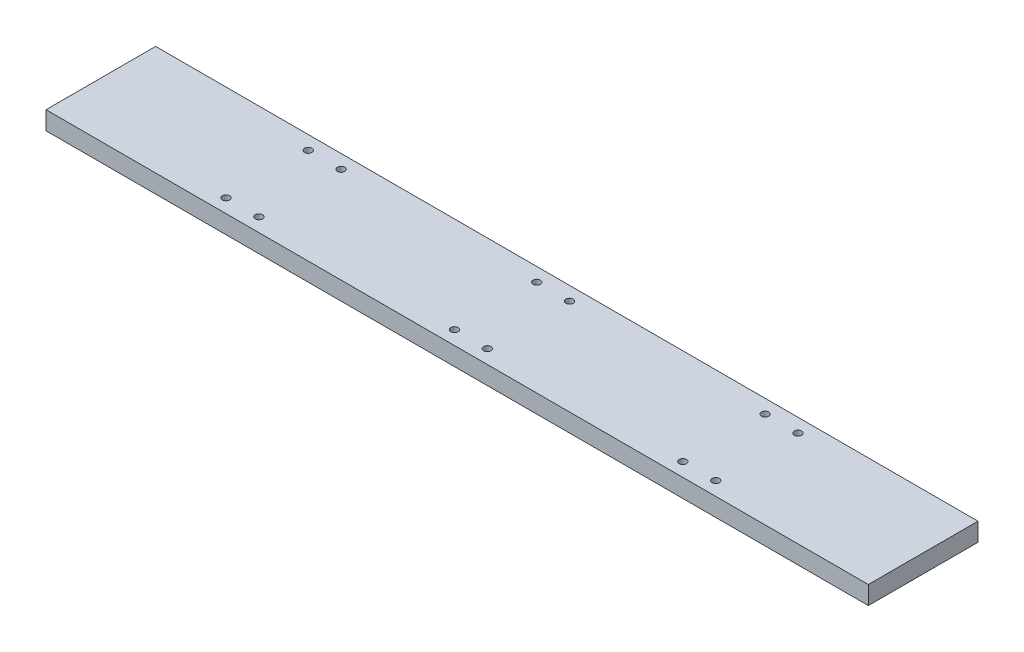
ISO-10303-21;
HEADER;
FILE_DESCRIPTION(('STEP AP214'),'2;1');
FILE_NAME('part.step','',(''),(''),'','','');
FILE_SCHEMA(('AUTOMOTIVE_DESIGN { 1 0 10303 214 1 1 1 1 }'));
ENDSEC;
DATA;
#1=APPLICATION_CONTEXT('core data for automotive mechanical design processes');
#2=APPLICATION_PROTOCOL_DEFINITION('international standard','automotive_design',2000,#1);
#3=PRODUCT_CONTEXT('',#1,'mechanical');
#4=PRODUCT('Part','Part','',(#3));
#5=PRODUCT_RELATED_PRODUCT_CATEGORY('part','',(#4));
#6=PRODUCT_DEFINITION_FORMATION('','',#4);
#7=PRODUCT_DEFINITION_CONTEXT('part definition',#1,'design');
#8=PRODUCT_DEFINITION('design','',#6,#7);
#9=PRODUCT_DEFINITION_SHAPE('','',#8);
#10=(LENGTH_UNIT() NAMED_UNIT(*) SI_UNIT(.MILLI.,.METRE.));
#11=(NAMED_UNIT(*) PLANE_ANGLE_UNIT() SI_UNIT($,.RADIAN.));
#12=(NAMED_UNIT(*) SI_UNIT($,.STERADIAN.) SOLID_ANGLE_UNIT());
#13=UNCERTAINTY_MEASURE_WITH_UNIT(LENGTH_MEASURE(1.E-05),#10,'distance_accuracy_value','');
#14=(GEOMETRIC_REPRESENTATION_CONTEXT(3) GLOBAL_UNCERTAINTY_ASSIGNED_CONTEXT((#13)) GLOBAL_UNIT_ASSIGNED_CONTEXT((#10,
#11,#12)) REPRESENTATION_CONTEXT('',''));
#15=CARTESIAN_POINT('',(0.,0.,0.));
#16=DIRECTION('',(0.,0.,1.));
#17=DIRECTION('',(1.,0.,0.));
#18=AXIS2_PLACEMENT_3D('',#15,#16,#17);
#19=CARTESIAN_POINT('',(225.,10.,30.));
#20=DIRECTION('',(-1.,0.,0.));
#21=DIRECTION('',(0.,0.,1.));
#22=AXIS2_PLACEMENT_3D('',#19,#20,#21);
#23=PLANE('',#22);
#24=DIRECTION('',(0.,0.,-1.));
#25=VECTOR('',#24,1.);
#26=CARTESIAN_POINT('',(225.,0.,30.));
#27=LINE('',#26,#25);
#28=CARTESIAN_POINT('',(225.,0.,30.));
#29=VERTEX_POINT('',#28);
#30=CARTESIAN_POINT('',(225.,0.,-30.));
#31=VERTEX_POINT('',#30);
#32=EDGE_CURVE('E96',#29,#31,#27,.T.);
#33=ORIENTED_EDGE('',*,*,#32,.T.);
#34=DIRECTION('',(0.,-1.,0.));
#35=VECTOR('',#34,1.);
#36=CARTESIAN_POINT('',(225.,10.,-30.));
#37=LINE('',#36,#35);
#38=CARTESIAN_POINT('',(225.,10.,-30.));
#39=VERTEX_POINT('',#38);
#40=EDGE_CURVE('E11',#39,#31,#37,.T.);
#41=ORIENTED_EDGE('',*,*,#40,.F.);
#42=DIRECTION('',(0.,0.,-1.));
#43=VECTOR('',#42,1.);
#44=CARTESIAN_POINT('',(225.,10.,30.));
#45=LINE('',#44,#43);
#46=CARTESIAN_POINT('',(225.,10.,30.));
#47=VERTEX_POINT('',#46);
#48=EDGE_CURVE('E84',#47,#39,#45,.T.);
#49=ORIENTED_EDGE('',*,*,#48,.F.);
#50=DIRECTION('',(0.,-1.,0.));
#51=VECTOR('',#50,1.);
#52=CARTESIAN_POINT('',(225.,10.,30.));
#53=LINE('',#52,#51);
#54=EDGE_CURVE('E92',#47,#29,#53,.T.);
#55=ORIENTED_EDGE('',*,*,#54,.T.);
#56=EDGE_LOOP('',(#33,#41,#49,#55));
#57=FACE_BOUND('',#56,.T.);
#58=ADVANCED_FACE('F33',(#57),#23,.F.);
#59=CARTESIAN_POINT('',(-225.,10.,-30.));
#60=DIRECTION('',(0.,0.,1.));
#61=DIRECTION('',(1.,0.,0.));
#62=AXIS2_PLACEMENT_3D('',#59,#60,#61);
#63=PLANE('',#62);
#64=DIRECTION('',(-1.,0.,0.));
#65=VECTOR('',#64,1.);
#66=CARTESIAN_POINT('',(-225.,0.,-30.));
#67=LINE('',#66,#65);
#68=CARTESIAN_POINT('',(-225.,0.,-30.));
#69=VERTEX_POINT('',#68);
#70=EDGE_CURVE('E88',#31,#69,#67,.T.);
#71=ORIENTED_EDGE('',*,*,#70,.T.);
#72=DIRECTION('',(0.,-1.,0.));
#73=VECTOR('',#72,1.);
#74=CARTESIAN_POINT('',(-225.,10.,-30.));
#75=LINE('',#74,#73);
#76=CARTESIAN_POINT('',(-225.,10.,-30.));
#77=VERTEX_POINT('',#76);
#78=EDGE_CURVE('E41',#77,#69,#75,.T.);
#79=ORIENTED_EDGE('',*,*,#78,.F.);
#80=DIRECTION('',(-1.,0.,0.));
#81=VECTOR('',#80,1.);
#82=CARTESIAN_POINT('',(-225.,10.,-30.));
#83=LINE('',#82,#81);
#84=EDGE_CURVE('E79',#39,#77,#83,.T.);
#85=ORIENTED_EDGE('',*,*,#84,.F.);
#86=ORIENTED_EDGE('',*,*,#40,.T.);
#87=EDGE_LOOP('',(#71,#79,#85,#86));
#88=FACE_BOUND('',#87,.T.);
#89=ADVANCED_FACE('F87',(#88),#63,.F.);
#90=CARTESIAN_POINT('',(-225.,10.,30.));
#91=DIRECTION('',(1.,0.,0.));
#92=DIRECTION('',(0.,0.,-1.));
#93=AXIS2_PLACEMENT_3D('',#90,#91,#92);
#94=PLANE('',#93);
#95=DIRECTION('',(0.,0.,1.));
#96=VECTOR('',#95,1.);
#97=CARTESIAN_POINT('',(-225.,0.,30.));
#98=LINE('',#97,#96);
#99=CARTESIAN_POINT('',(-225.,0.,30.));
#100=VERTEX_POINT('',#99);
#101=EDGE_CURVE('E66',#69,#100,#98,.T.);
#102=ORIENTED_EDGE('',*,*,#101,.T.);
#103=DIRECTION('',(0.,-1.,0.));
#104=VECTOR('',#103,1.);
#105=CARTESIAN_POINT('',(-225.,10.,30.));
#106=LINE('',#105,#104);
#107=CARTESIAN_POINT('',(-225.,10.,30.));
#108=VERTEX_POINT('',#107);
#109=EDGE_CURVE('E89',#108,#100,#106,.T.);
#110=ORIENTED_EDGE('',*,*,#109,.F.);
#111=DIRECTION('',(0.,0.,1.));
#112=VECTOR('',#111,1.);
#113=CARTESIAN_POINT('',(-225.,10.,30.));
#114=LINE('',#113,#112);
#115=EDGE_CURVE('E82',#77,#108,#114,.T.);
#116=ORIENTED_EDGE('',*,*,#115,.F.);
#117=ORIENTED_EDGE('',*,*,#78,.T.);
#118=EDGE_LOOP('',(#102,#110,#116,#117));
#119=FACE_BOUND('',#118,.T.);
#120=ADVANCED_FACE('F90',(#119),#94,.F.);
#121=CARTESIAN_POINT('',(-225.,10.,30.));
#122=DIRECTION('',(0.,0.,-1.));
#123=DIRECTION('',(-1.,0.,0.));
#124=AXIS2_PLACEMENT_3D('',#121,#122,#123);
#125=PLANE('',#124);
#126=DIRECTION('',(1.,0.,0.));
#127=VECTOR('',#126,1.);
#128=CARTESIAN_POINT('',(-225.,0.,30.));
#129=LINE('',#128,#127);
#130=EDGE_CURVE('E72',#100,#29,#129,.T.);
#131=ORIENTED_EDGE('',*,*,#130,.T.);
#132=ORIENTED_EDGE('',*,*,#54,.F.);
#133=DIRECTION('',(1.,0.,0.));
#134=VECTOR('',#133,1.);
#135=CARTESIAN_POINT('',(-225.,10.,30.));
#136=LINE('',#135,#134);
#137=EDGE_CURVE('E49',#108,#47,#136,.T.);
#138=ORIENTED_EDGE('',*,*,#137,.F.);
#139=ORIENTED_EDGE('',*,*,#109,.T.);
#140=EDGE_LOOP('',(#131,#132,#138,#139));
#141=FACE_BOUND('',#140,.T.);
#142=ADVANCED_FACE('F104',(#141),#125,.F.);
#143=CARTESIAN_POINT('',(0.,10.,0.));
#144=DIRECTION('',(0.,-1.,0.));
#145=DIRECTION('',(0.,0.,-1.));
#146=AXIS2_PLACEMENT_3D('',#143,#144,#145);
#147=PLANE('',#146);
#148=CARTESIAN_POINT('',(116.,10.,-22.5));
#149=DIRECTION('',(0.,1.,0.));
#150=DIRECTION('',(0.,0.,1.));
#151=AXIS2_PLACEMENT_3D('',#148,#149,#150);
#152=CIRCLE('',#151,2.);
#153=CARTESIAN_POINT('',(116.,10.,-20.5));
#154=VERTEX_POINT('',#153);
#155=EDGE_CURVE('E159',#154,#154,#152,.T.);
#156=ORIENTED_EDGE('',*,*,#155,.F.);
#157=EDGE_LOOP('',(#156));
#158=FACE_BOUND('',#157,.T.);
#159=CARTESIAN_POINT('',(134.,10.,-22.5));
#160=DIRECTION('',(0.,1.,0.));
#161=DIRECTION('',(0.,0.,-1.));
#162=AXIS2_PLACEMENT_3D('',#159,#160,#161);
#163=CIRCLE('',#162,2.);
#164=CARTESIAN_POINT('',(134.,10.,-24.5));
#165=VERTEX_POINT('',#164);
#166=EDGE_CURVE('E153',#165,#165,#163,.T.);
#167=ORIENTED_EDGE('',*,*,#166,.F.);
#168=EDGE_LOOP('',(#167));
#169=FACE_BOUND('',#168,.T.);
#170=CARTESIAN_POINT('',(134.,10.,22.5));
#171=DIRECTION('',(0.,1.,0.));
#172=DIRECTION('',(0.,0.,1.));
#173=AXIS2_PLACEMENT_3D('',#170,#171,#172);
#174=CIRCLE('',#173,2.);
#175=CARTESIAN_POINT('',(134.,10.,24.5));
#176=VERTEX_POINT('',#175);
#177=EDGE_CURVE('E147',#176,#176,#174,.T.);
#178=ORIENTED_EDGE('',*,*,#177,.F.);
#179=EDGE_LOOP('',(#178));
#180=FACE_BOUND('',#179,.T.);
#181=CARTESIAN_POINT('',(116.,10.,22.5));
#182=DIRECTION('',(0.,1.,0.));
#183=DIRECTION('',(0.,0.,-1.));
#184=AXIS2_PLACEMENT_3D('',#181,#182,#183);
#185=CIRCLE('',#184,2.);
#186=CARTESIAN_POINT('',(116.,10.,20.5));
#187=VERTEX_POINT('',#186);
#188=EDGE_CURVE('E141',#187,#187,#185,.T.);
#189=ORIENTED_EDGE('',*,*,#188,.F.);
#190=EDGE_LOOP('',(#189));
#191=FACE_BOUND('',#190,.T.);
#192=CARTESIAN_POINT('',(9.00000000000001,10.,22.5));
#193=DIRECTION('',(0.,1.,0.));
#194=DIRECTION('',(0.,0.,-1.));
#195=AXIS2_PLACEMENT_3D('',#192,#193,#194);
#196=CIRCLE('',#195,2.);
#197=CARTESIAN_POINT('',(9.00000000000001,10.,20.5));
#198=VERTEX_POINT('',#197);
#199=EDGE_CURVE('E135',#198,#198,#196,.T.);
#200=ORIENTED_EDGE('',*,*,#199,.F.);
#201=EDGE_LOOP('',(#200));
#202=FACE_BOUND('',#201,.T.);
#203=CARTESIAN_POINT('',(-116.,10.,-22.5));
#204=DIRECTION('',(0.,1.,0.));
#205=DIRECTION('',(0.,0.,-1.));
#206=AXIS2_PLACEMENT_3D('',#203,#204,#205);
#207=CIRCLE('',#206,2.);
#208=CARTESIAN_POINT('',(-116.,10.,-24.5));
#209=VERTEX_POINT('',#208);
#210=EDGE_CURVE('E129',#209,#209,#207,.T.);
#211=ORIENTED_EDGE('',*,*,#210,.F.);
#212=EDGE_LOOP('',(#211));
#213=FACE_BOUND('',#212,.T.);
#214=CARTESIAN_POINT('',(-134.,10.,-22.5));
#215=DIRECTION('',(0.,1.,0.));
#216=DIRECTION('',(0.,0.,1.));
#217=AXIS2_PLACEMENT_3D('',#214,#215,#216);
#218=CIRCLE('',#217,2.);
#219=CARTESIAN_POINT('',(-134.,10.,-20.5));
#220=VERTEX_POINT('',#219);
#221=EDGE_CURVE('E123',#220,#220,#218,.T.);
#222=ORIENTED_EDGE('',*,*,#221,.F.);
#223=EDGE_LOOP('',(#222));
#224=FACE_BOUND('',#223,.T.);
#225=CARTESIAN_POINT('',(-134.,10.,22.5000000000001));
#226=DIRECTION('',(0.,1.,0.));
#227=DIRECTION('',(0.,0.,-1.));
#228=AXIS2_PLACEMENT_3D('',#225,#226,#227);
#229=CIRCLE('',#228,2.);
#230=CARTESIAN_POINT('',(-134.,10.,20.5000000000001));
#231=VERTEX_POINT('',#230);
#232=EDGE_CURVE('E116',#231,#231,#229,.T.);
#233=ORIENTED_EDGE('',*,*,#232,.F.);
#234=EDGE_LOOP('',(#233));
#235=FACE_BOUND('',#234,.T.);
#236=CARTESIAN_POINT('',(-116.,10.,22.5));
#237=DIRECTION('',(0.,1.,0.));
#238=DIRECTION('',(0.,0.,1.));
#239=AXIS2_PLACEMENT_3D('',#236,#237,#238);
#240=CIRCLE('',#239,2.);
#241=CARTESIAN_POINT('',(-116.,10.,24.5));
#242=VERTEX_POINT('',#241);
#243=EDGE_CURVE('E176',#242,#242,#240,.T.);
#244=ORIENTED_EDGE('',*,*,#243,.F.);
#245=EDGE_LOOP('',(#244));
#246=FACE_BOUND('',#245,.T.);
#247=CARTESIAN_POINT('',(-8.99999999999999,10.,22.5));
#248=DIRECTION('',(0.,1.,0.));
#249=DIRECTION('',(0.,0.,1.));
#250=AXIS2_PLACEMENT_3D('',#247,#248,#249);
#251=CIRCLE('',#250,2.);
#252=CARTESIAN_POINT('',(-8.99999999999999,10.,24.5));
#253=VERTEX_POINT('',#252);
#254=EDGE_CURVE('E170',#253,#253,#251,.T.);
#255=ORIENTED_EDGE('',*,*,#254,.F.);
#256=EDGE_LOOP('',(#255));
#257=FACE_BOUND('',#256,.T.);
#258=CARTESIAN_POINT('',(-9.,10.,-22.5));
#259=DIRECTION('',(0.,1.,0.));
#260=DIRECTION('',(0.,0.,-1.));
#261=AXIS2_PLACEMENT_3D('',#258,#259,#260);
#262=CIRCLE('',#261,2.);
#263=CARTESIAN_POINT('',(-9.,10.,-24.5));
#264=VERTEX_POINT('',#263);
#265=EDGE_CURVE('E164',#264,#264,#262,.T.);
#266=ORIENTED_EDGE('',*,*,#265,.F.);
#267=EDGE_LOOP('',(#266));
#268=FACE_BOUND('',#267,.T.);
#269=CARTESIAN_POINT('',(9.,10.,-22.5));
#270=DIRECTION('',(0.,1.,0.));
#271=DIRECTION('',(0.,0.,1.));
#272=AXIS2_PLACEMENT_3D('',#269,#270,#271);
#273=CIRCLE('',#272,2.);
#274=CARTESIAN_POINT('',(9.,10.,-20.5));
#275=VERTEX_POINT('',#274);
#276=EDGE_CURVE('E110',#275,#275,#273,.T.);
#277=ORIENTED_EDGE('',*,*,#276,.F.);
#278=EDGE_LOOP('',(#277));
#279=FACE_BOUND('',#278,.T.);
#280=ORIENTED_EDGE('',*,*,#48,.T.);
#281=ORIENTED_EDGE('',*,*,#84,.T.);
#282=ORIENTED_EDGE('',*,*,#115,.T.);
#283=ORIENTED_EDGE('',*,*,#137,.T.);
#284=EDGE_LOOP('',(#280,#281,#282,#283));
#285=FACE_BOUND('',#284,.T.);
#286=ADVANCED_FACE('F80',(#158,#169,#180,#191,#202,#213,#224,#235,#246,#257,#268,#279,#285),
#147,.F.);
#287=CARTESIAN_POINT('',(0.,0.,0.));
#288=DIRECTION('',(0.,-1.,0.));
#289=DIRECTION('',(0.,0.,-1.));
#290=AXIS2_PLACEMENT_3D('',#287,#288,#289);
#291=PLANE('',#290);
#292=CARTESIAN_POINT('',(116.,0.,-22.5));
#293=DIRECTION('',(0.,1.,0.));
#294=DIRECTION('',(0.,0.,1.));
#295=AXIS2_PLACEMENT_3D('',#292,#293,#294);
#296=CIRCLE('',#295,2.);
#297=CARTESIAN_POINT('',(116.,0.,-20.5));
#298=VERTEX_POINT('',#297);
#299=EDGE_CURVE('E113',#298,#298,#296,.T.);
#300=ORIENTED_EDGE('',*,*,#299,.T.);
#301=EDGE_LOOP('',(#300));
#302=FACE_BOUND('',#301,.T.);
#303=CARTESIAN_POINT('',(134.,0.,-22.5));
#304=DIRECTION('',(0.,1.,0.));
#305=DIRECTION('',(0.,0.,-1.));
#306=AXIS2_PLACEMENT_3D('',#303,#304,#305);
#307=CIRCLE('',#306,2.);
#308=CARTESIAN_POINT('',(134.,0.,-24.5));
#309=VERTEX_POINT('',#308);
#310=EDGE_CURVE('E156',#309,#309,#307,.T.);
#311=ORIENTED_EDGE('',*,*,#310,.T.);
#312=EDGE_LOOP('',(#311));
#313=FACE_BOUND('',#312,.T.);
#314=CARTESIAN_POINT('',(134.,0.,22.5));
#315=DIRECTION('',(0.,1.,0.));
#316=DIRECTION('',(0.,0.,1.));
#317=AXIS2_PLACEMENT_3D('',#314,#315,#316);
#318=CIRCLE('',#317,2.);
#319=CARTESIAN_POINT('',(134.,0.,24.5));
#320=VERTEX_POINT('',#319);
#321=EDGE_CURVE('E150',#320,#320,#318,.T.);
#322=ORIENTED_EDGE('',*,*,#321,.T.);
#323=EDGE_LOOP('',(#322));
#324=FACE_BOUND('',#323,.T.);
#325=CARTESIAN_POINT('',(116.,0.,22.5));
#326=DIRECTION('',(0.,1.,0.));
#327=DIRECTION('',(0.,0.,-1.));
#328=AXIS2_PLACEMENT_3D('',#325,#326,#327);
#329=CIRCLE('',#328,2.);
#330=CARTESIAN_POINT('',(116.,0.,20.5));
#331=VERTEX_POINT('',#330);
#332=EDGE_CURVE('E144',#331,#331,#329,.T.);
#333=ORIENTED_EDGE('',*,*,#332,.T.);
#334=EDGE_LOOP('',(#333));
#335=FACE_BOUND('',#334,.T.);
#336=CARTESIAN_POINT('',(9.00000000000001,0.,22.5));
#337=DIRECTION('',(0.,1.,0.));
#338=DIRECTION('',(0.,0.,-1.));
#339=AXIS2_PLACEMENT_3D('',#336,#337,#338);
#340=CIRCLE('',#339,2.);
#341=CARTESIAN_POINT('',(9.00000000000001,0.,20.5));
#342=VERTEX_POINT('',#341);
#343=EDGE_CURVE('E138',#342,#342,#340,.T.);
#344=ORIENTED_EDGE('',*,*,#343,.T.);
#345=EDGE_LOOP('',(#344));
#346=FACE_BOUND('',#345,.T.);
#347=CARTESIAN_POINT('',(-116.,0.,-22.5));
#348=DIRECTION('',(0.,1.,0.));
#349=DIRECTION('',(0.,0.,-1.));
#350=AXIS2_PLACEMENT_3D('',#347,#348,#349);
#351=CIRCLE('',#350,2.);
#352=CARTESIAN_POINT('',(-116.,0.,-24.5));
#353=VERTEX_POINT('',#352);
#354=EDGE_CURVE('E132',#353,#353,#351,.T.);
#355=ORIENTED_EDGE('',*,*,#354,.T.);
#356=EDGE_LOOP('',(#355));
#357=FACE_BOUND('',#356,.T.);
#358=CARTESIAN_POINT('',(-134.,0.,-22.5));
#359=DIRECTION('',(0.,1.,0.));
#360=DIRECTION('',(0.,0.,1.));
#361=AXIS2_PLACEMENT_3D('',#358,#359,#360);
#362=CIRCLE('',#361,2.);
#363=CARTESIAN_POINT('',(-134.,0.,-20.5));
#364=VERTEX_POINT('',#363);
#365=EDGE_CURVE('E126',#364,#364,#362,.T.);
#366=ORIENTED_EDGE('',*,*,#365,.T.);
#367=EDGE_LOOP('',(#366));
#368=FACE_BOUND('',#367,.T.);
#369=CARTESIAN_POINT('',(-134.,0.,22.5000000000001));
#370=DIRECTION('',(0.,1.,0.));
#371=DIRECTION('',(0.,0.,-1.));
#372=AXIS2_PLACEMENT_3D('',#369,#370,#371);
#373=CIRCLE('',#372,2.);
#374=CARTESIAN_POINT('',(-134.,0.,20.5000000000001));
#375=VERTEX_POINT('',#374);
#376=EDGE_CURVE('E119',#375,#375,#373,.T.);
#377=ORIENTED_EDGE('',*,*,#376,.T.);
#378=EDGE_LOOP('',(#377));
#379=FACE_BOUND('',#378,.T.);
#380=CARTESIAN_POINT('',(-116.,0.,22.5));
#381=DIRECTION('',(0.,1.,0.));
#382=DIRECTION('',(0.,0.,1.));
#383=AXIS2_PLACEMENT_3D('',#380,#381,#382);
#384=CIRCLE('',#383,2.);
#385=CARTESIAN_POINT('',(-116.,0.,24.5));
#386=VERTEX_POINT('',#385);
#387=EDGE_CURVE('E120',#386,#386,#384,.T.);
#388=ORIENTED_EDGE('',*,*,#387,.T.);
#389=EDGE_LOOP('',(#388));
#390=FACE_BOUND('',#389,.T.);
#391=CARTESIAN_POINT('',(-8.99999999999999,0.,22.5));
#392=DIRECTION('',(0.,1.,0.));
#393=DIRECTION('',(0.,0.,1.));
#394=AXIS2_PLACEMENT_3D('',#391,#392,#393);
#395=CIRCLE('',#394,2.);
#396=CARTESIAN_POINT('',(-8.99999999999999,0.,24.5));
#397=VERTEX_POINT('',#396);
#398=EDGE_CURVE('E173',#397,#397,#395,.T.);
#399=ORIENTED_EDGE('',*,*,#398,.T.);
#400=EDGE_LOOP('',(#399));
#401=FACE_BOUND('',#400,.T.);
#402=CARTESIAN_POINT('',(-9.,0.,-22.5));
#403=DIRECTION('',(0.,1.,0.));
#404=DIRECTION('',(0.,0.,-1.));
#405=AXIS2_PLACEMENT_3D('',#402,#403,#404);
#406=CIRCLE('',#405,2.);
#407=CARTESIAN_POINT('',(-9.,0.,-24.5));
#408=VERTEX_POINT('',#407);
#409=EDGE_CURVE('E167',#408,#408,#406,.T.);
#410=ORIENTED_EDGE('',*,*,#409,.T.);
#411=EDGE_LOOP('',(#410));
#412=FACE_BOUND('',#411,.T.);
#413=CARTESIAN_POINT('',(9.,0.,-22.5));
#414=DIRECTION('',(0.,1.,0.));
#415=DIRECTION('',(0.,0.,1.));
#416=AXIS2_PLACEMENT_3D('',#413,#414,#415);
#417=CIRCLE('',#416,2.);
#418=CARTESIAN_POINT('',(9.,0.,-20.5));
#419=VERTEX_POINT('',#418);
#420=EDGE_CURVE('E99',#419,#419,#417,.T.);
#421=ORIENTED_EDGE('',*,*,#420,.T.);
#422=EDGE_LOOP('',(#421));
#423=FACE_BOUND('',#422,.T.);
#424=ORIENTED_EDGE('',*,*,#32,.F.);
#425=ORIENTED_EDGE('',*,*,#130,.F.);
#426=ORIENTED_EDGE('',*,*,#101,.F.);
#427=ORIENTED_EDGE('',*,*,#70,.F.);
#428=EDGE_LOOP('',(#424,#425,#426,#427));
#429=FACE_BOUND('',#428,.T.);
#430=ADVANCED_FACE('F107',(#302,#313,#324,#335,#346,#357,#368,#379,#390,#401,#412,#423,#429),
#291,.T.);
#431=CARTESIAN_POINT('',(9.,0.,-22.5));
#432=DIRECTION('',(0.,1.,0.));
#433=DIRECTION('',(0.,0.,1.));
#434=AXIS2_PLACEMENT_3D('',#431,#432,#433);
#435=CYLINDRICAL_SURFACE('',#434,2.);
#436=ORIENTED_EDGE('',*,*,#420,.F.);
#437=EDGE_LOOP('',(#436));
#438=FACE_BOUND('',#437,.T.);
#439=ORIENTED_EDGE('',*,*,#276,.T.);
#440=EDGE_LOOP('',(#439));
#441=FACE_BOUND('',#440,.T.);
#442=ADVANCED_FACE('F202',(#438,#441),#435,.F.);
#443=CARTESIAN_POINT('',(-9.,0.,-22.5));
#444=DIRECTION('',(0.,1.,0.));
#445=DIRECTION('',(0.,0.,1.));
#446=AXIS2_PLACEMENT_3D('',#443,#444,#445);
#447=CYLINDRICAL_SURFACE('',#446,2.);
#448=ORIENTED_EDGE('',*,*,#409,.F.);
#449=EDGE_LOOP('',(#448));
#450=FACE_BOUND('',#449,.T.);
#451=ORIENTED_EDGE('',*,*,#265,.T.);
#452=EDGE_LOOP('',(#451));
#453=FACE_BOUND('',#452,.T.);
#454=ADVANCED_FACE('F204',(#450,#453),#447,.F.);
#455=CARTESIAN_POINT('',(-8.99999999999999,0.,22.5));
#456=DIRECTION('',(0.,1.,0.));
#457=DIRECTION('',(0.,0.,1.));
#458=AXIS2_PLACEMENT_3D('',#455,#456,#457);
#459=CYLINDRICAL_SURFACE('',#458,2.);
#460=ORIENTED_EDGE('',*,*,#398,.F.);
#461=EDGE_LOOP('',(#460));
#462=FACE_BOUND('',#461,.T.);
#463=ORIENTED_EDGE('',*,*,#254,.T.);
#464=EDGE_LOOP('',(#463));
#465=FACE_BOUND('',#464,.T.);
#466=ADVANCED_FACE('F188',(#462,#465),#459,.F.);
#467=CARTESIAN_POINT('',(-116.,0.,22.5));
#468=DIRECTION('',(0.,1.,0.));
#469=DIRECTION('',(0.,0.,1.));
#470=AXIS2_PLACEMENT_3D('',#467,#468,#469);
#471=CYLINDRICAL_SURFACE('',#470,2.);
#472=ORIENTED_EDGE('',*,*,#387,.F.);
#473=EDGE_LOOP('',(#472));
#474=FACE_BOUND('',#473,.T.);
#475=ORIENTED_EDGE('',*,*,#243,.T.);
#476=EDGE_LOOP('',(#475));
#477=FACE_BOUND('',#476,.T.);
#478=ADVANCED_FACE('F184',(#474,#477),#471,.F.);
#479=CARTESIAN_POINT('',(-134.,0.,22.5000000000001));
#480=DIRECTION('',(0.,1.,0.));
#481=DIRECTION('',(0.,0.,1.));
#482=AXIS2_PLACEMENT_3D('',#479,#480,#481);
#483=CYLINDRICAL_SURFACE('',#482,2.);
#484=ORIENTED_EDGE('',*,*,#376,.F.);
#485=EDGE_LOOP('',(#484));
#486=FACE_BOUND('',#485,.T.);
#487=ORIENTED_EDGE('',*,*,#232,.T.);
#488=EDGE_LOOP('',(#487));
#489=FACE_BOUND('',#488,.T.);
#490=ADVANCED_FACE('F187',(#486,#489),#483,.F.);
#491=CARTESIAN_POINT('',(-134.,0.,-22.5));
#492=DIRECTION('',(0.,1.,0.));
#493=DIRECTION('',(0.,0.,1.));
#494=AXIS2_PLACEMENT_3D('',#491,#492,#493);
#495=CYLINDRICAL_SURFACE('',#494,2.);
#496=ORIENTED_EDGE('',*,*,#365,.F.);
#497=EDGE_LOOP('',(#496));
#498=FACE_BOUND('',#497,.T.);
#499=ORIENTED_EDGE('',*,*,#221,.T.);
#500=EDGE_LOOP('',(#499));
#501=FACE_BOUND('',#500,.T.);
#502=ADVANCED_FACE('F275',(#498,#501),#495,.F.);
#503=CARTESIAN_POINT('',(-116.,0.,-22.5));
#504=DIRECTION('',(0.,1.,0.));
#505=DIRECTION('',(0.,0.,1.));
#506=AXIS2_PLACEMENT_3D('',#503,#504,#505);
#507=CYLINDRICAL_SURFACE('',#506,2.);
#508=ORIENTED_EDGE('',*,*,#354,.F.);
#509=EDGE_LOOP('',(#508));
#510=FACE_BOUND('',#509,.T.);
#511=ORIENTED_EDGE('',*,*,#210,.T.);
#512=EDGE_LOOP('',(#511));
#513=FACE_BOUND('',#512,.T.);
#514=ADVANCED_FACE('F284',(#510,#513),#507,.F.);
#515=CARTESIAN_POINT('',(9.00000000000001,0.,22.5));
#516=DIRECTION('',(0.,1.,0.));
#517=DIRECTION('',(0.,0.,1.));
#518=AXIS2_PLACEMENT_3D('',#515,#516,#517);
#519=CYLINDRICAL_SURFACE('',#518,2.);
#520=ORIENTED_EDGE('',*,*,#343,.F.);
#521=EDGE_LOOP('',(#520));
#522=FACE_BOUND('',#521,.T.);
#523=ORIENTED_EDGE('',*,*,#199,.T.);
#524=EDGE_LOOP('',(#523));
#525=FACE_BOUND('',#524,.T.);
#526=ADVANCED_FACE('F294',(#522,#525),#519,.F.);
#527=CARTESIAN_POINT('',(116.,0.,22.5));
#528=DIRECTION('',(0.,1.,0.));
#529=DIRECTION('',(0.,0.,1.));
#530=AXIS2_PLACEMENT_3D('',#527,#528,#529);
#531=CYLINDRICAL_SURFACE('',#530,2.);
#532=ORIENTED_EDGE('',*,*,#332,.F.);
#533=EDGE_LOOP('',(#532));
#534=FACE_BOUND('',#533,.T.);
#535=ORIENTED_EDGE('',*,*,#188,.T.);
#536=EDGE_LOOP('',(#535));
#537=FACE_BOUND('',#536,.T.);
#538=ADVANCED_FACE('F304',(#534,#537),#531,.F.);
#539=CARTESIAN_POINT('',(134.,0.,22.5));
#540=DIRECTION('',(0.,1.,0.));
#541=DIRECTION('',(0.,0.,1.));
#542=AXIS2_PLACEMENT_3D('',#539,#540,#541);
#543=CYLINDRICAL_SURFACE('',#542,2.);
#544=ORIENTED_EDGE('',*,*,#321,.F.);
#545=EDGE_LOOP('',(#544));
#546=FACE_BOUND('',#545,.T.);
#547=ORIENTED_EDGE('',*,*,#177,.T.);
#548=EDGE_LOOP('',(#547));
#549=FACE_BOUND('',#548,.T.);
#550=ADVANCED_FACE('F314',(#546,#549),#543,.F.);
#551=CARTESIAN_POINT('',(134.,0.,-22.5));
#552=DIRECTION('',(0.,1.,0.));
#553=DIRECTION('',(0.,0.,1.));
#554=AXIS2_PLACEMENT_3D('',#551,#552,#553);
#555=CYLINDRICAL_SURFACE('',#554,2.);
#556=ORIENTED_EDGE('',*,*,#310,.F.);
#557=EDGE_LOOP('',(#556));
#558=FACE_BOUND('',#557,.T.);
#559=ORIENTED_EDGE('',*,*,#166,.T.);
#560=EDGE_LOOP('',(#559));
#561=FACE_BOUND('',#560,.T.);
#562=ADVANCED_FACE('F324',(#558,#561),#555,.F.);
#563=CARTESIAN_POINT('',(116.,0.,-22.5));
#564=DIRECTION('',(0.,1.,0.));
#565=DIRECTION('',(0.,0.,1.));
#566=AXIS2_PLACEMENT_3D('',#563,#564,#565);
#567=CYLINDRICAL_SURFACE('',#566,2.);
#568=ORIENTED_EDGE('',*,*,#299,.F.);
#569=EDGE_LOOP('',(#568));
#570=FACE_BOUND('',#569,.T.);
#571=ORIENTED_EDGE('',*,*,#155,.T.);
#572=EDGE_LOOP('',(#571));
#573=FACE_BOUND('',#572,.T.);
#574=ADVANCED_FACE('F334',(#570,#573),#567,.F.);
#575=CLOSED_SHELL('',(#58,#89,#120,#142,#286,#430,#442,#454,#466,#478,#490,#502,#514,#526,#538,
#550,#562,#574));
#576=MANIFOLD_SOLID_BREP('B2',#575);
#577=ADVANCED_BREP_SHAPE_REPRESENTATION('',(#18,#576),#14);
#578=SHAPE_DEFINITION_REPRESENTATION(#9,#577);
ENDSEC;
END-ISO-10303-21;
